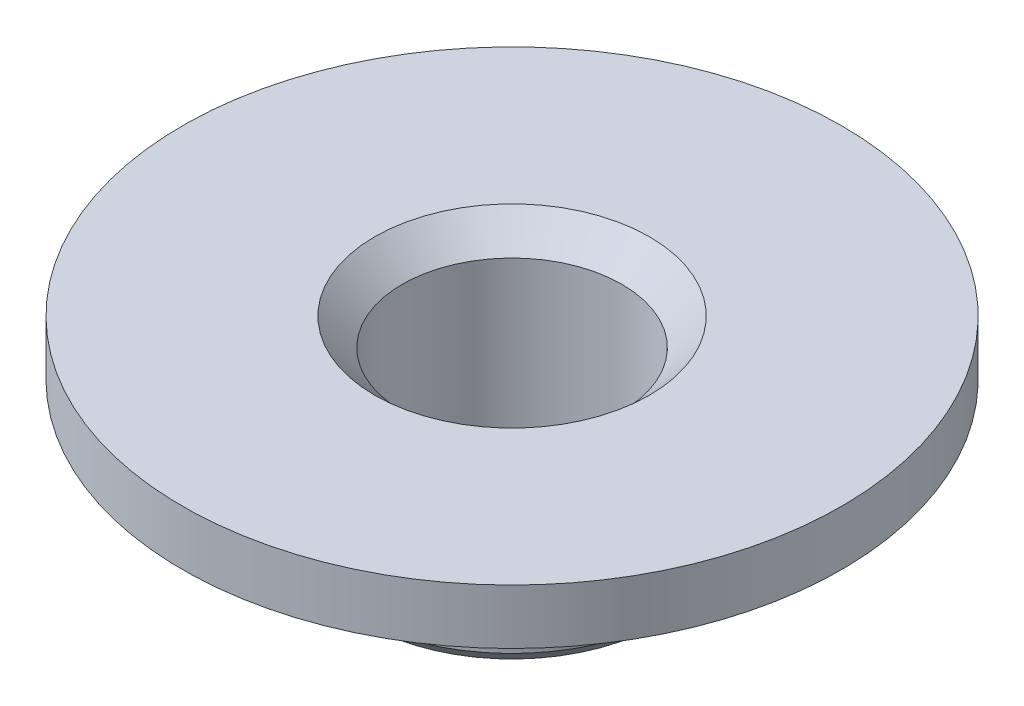
ISO-10303-21;
HEADER;
FILE_DESCRIPTION(('STEP AP214'),'2;1');
FILE_NAME('part.step','',(''),(''),'','','');
FILE_SCHEMA(('AUTOMOTIVE_DESIGN { 1 0 10303 214 1 1 1 1 }'));
ENDSEC;
DATA;
#1=APPLICATION_CONTEXT('core data for automotive mechanical design processes');
#2=APPLICATION_PROTOCOL_DEFINITION('international standard','automotive_design',2000,#1);
#3=PRODUCT_CONTEXT('',#1,'mechanical');
#4=PRODUCT('Part','Part','',(#3));
#5=PRODUCT_RELATED_PRODUCT_CATEGORY('part','',(#4));
#6=PRODUCT_DEFINITION_FORMATION('','',#4);
#7=PRODUCT_DEFINITION_CONTEXT('part definition',#1,'design');
#8=PRODUCT_DEFINITION('design','',#6,#7);
#9=PRODUCT_DEFINITION_SHAPE('','',#8);
#10=(LENGTH_UNIT() NAMED_UNIT(*) SI_UNIT(.MILLI.,.METRE.));
#11=(NAMED_UNIT(*) PLANE_ANGLE_UNIT() SI_UNIT($,.RADIAN.));
#12=(NAMED_UNIT(*) SI_UNIT($,.STERADIAN.) SOLID_ANGLE_UNIT());
#13=UNCERTAINTY_MEASURE_WITH_UNIT(LENGTH_MEASURE(1.E-05),#10,'distance_accuracy_value','');
#14=(GEOMETRIC_REPRESENTATION_CONTEXT(3) GLOBAL_UNCERTAINTY_ASSIGNED_CONTEXT((#13)) GLOBAL_UNIT_ASSIGNED_CONTEXT((#10,
#11,#12)) REPRESENTATION_CONTEXT('',''));
#15=CARTESIAN_POINT('',(0.,0.,0.));
#16=DIRECTION('',(0.,0.,1.));
#17=DIRECTION('',(1.,0.,0.));
#18=AXIS2_PLACEMENT_3D('',#15,#16,#17);
#19=CARTESIAN_POINT('',(3.,0.,0.));
#20=DIRECTION('',(0.,-1.,0.));
#21=DIRECTION('',(0.,0.,-1.));
#22=AXIS2_PLACEMENT_3D('',#19,#20,#21);
#23=PLANE('',#22);
#24=CARTESIAN_POINT('',(0.,0.,0.));
#25=DIRECTION('',(0.,-1.,0.));
#26=DIRECTION('',(0.,0.,-1.));
#27=AXIS2_PLACEMENT_3D('',#24,#25,#26);
#28=CIRCLE('',#27,2.7);
#29=CARTESIAN_POINT('',(0.,0.,2.7));
#30=VERTEX_POINT('',#29);
#31=EDGE_CURVE('E39',#30,#30,#28,.T.);
#32=ORIENTED_EDGE('',*,*,#31,.T.);
#33=EDGE_LOOP('',(#32));
#34=FACE_BOUND('',#33,.T.);
#35=CARTESIAN_POINT('',(0.,0.,0.));
#36=DIRECTION('',(0.,-1.,0.));
#37=DIRECTION('',(0.,0.,-1.));
#38=AXIS2_PLACEMENT_3D('',#35,#36,#37);
#39=CIRCLE('',#38,2.);
#40=CARTESIAN_POINT('',(0.,0.,-2.));
#41=VERTEX_POINT('',#40);
#42=EDGE_CURVE('E58',#41,#41,#39,.T.);
#43=ORIENTED_EDGE('',*,*,#42,.F.);
#44=EDGE_LOOP('',(#43));
#45=FACE_BOUND('',#44,.T.);
#46=ADVANCED_FACE('F32',(#34,#45),#23,.T.);
#47=CARTESIAN_POINT('',(0.,0.,0.));
#48=DIRECTION('',(0.,-1.,0.));
#49=DIRECTION('',(0.,0.,-1.));
#50=AXIS2_PLACEMENT_3D('',#47,#48,#49);
#51=CYLINDRICAL_SURFACE('',#50,2.);
#52=CARTESIAN_POINT('',(0.,3.,0.));
#53=DIRECTION('',(0.,1.,0.));
#54=DIRECTION('',(0.,0.,1.));
#55=AXIS2_PLACEMENT_3D('',#52,#53,#54);
#56=CIRCLE('',#55,2.);
#57=CARTESIAN_POINT('',(0.,3.,2.));
#58=VERTEX_POINT('',#57);
#59=EDGE_CURVE('E52',#58,#58,#56,.T.);
#60=ORIENTED_EDGE('',*,*,#59,.T.);
#61=EDGE_LOOP('',(#60));
#62=FACE_BOUND('',#61,.T.);
#63=ORIENTED_EDGE('',*,*,#42,.T.);
#64=EDGE_LOOP('',(#63));
#65=FACE_BOUND('',#64,.T.);
#66=ADVANCED_FACE('F91',(#62,#65),#51,.F.);
#67=CARTESIAN_POINT('',(2.,3.5,0.));
#68=DIRECTION('',(0.,1.,0.));
#69=DIRECTION('',(0.,0.,1.));
#70=AXIS2_PLACEMENT_3D('',#67,#68,#69);
#71=PLANE('',#70);
#72=CARTESIAN_POINT('',(0.,3.5,0.));
#73=DIRECTION('',(0.,1.,0.));
#74=DIRECTION('',(0.,0.,1.));
#75=AXIS2_PLACEMENT_3D('',#72,#73,#74);
#76=CIRCLE('',#75,2.5);
#77=CARTESIAN_POINT('',(0.,3.5,2.5));
#78=VERTEX_POINT('',#77);
#79=EDGE_CURVE('E55',#78,#78,#76,.F.);
#80=ORIENTED_EDGE('',*,*,#79,.T.);
#81=EDGE_LOOP('',(#80));
#82=FACE_BOUND('',#81,.T.);
#83=CARTESIAN_POINT('',(0.,3.5,0.));
#84=DIRECTION('',(0.,-1.,0.));
#85=DIRECTION('',(0.,0.,-1.));
#86=AXIS2_PLACEMENT_3D('',#83,#84,#85);
#87=CIRCLE('',#86,6.);
#88=CARTESIAN_POINT('',(0.,3.5,-6.));
#89=VERTEX_POINT('',#88);
#90=EDGE_CURVE('E61',#89,#89,#87,.T.);
#91=ORIENTED_EDGE('',*,*,#90,.F.);
#92=EDGE_LOOP('',(#91));
#93=FACE_BOUND('',#92,.T.);
#94=ADVANCED_FACE('F96',(#82,#93),#71,.T.);
#95=CARTESIAN_POINT('',(0.,0.,0.));
#96=DIRECTION('',(0.,-1.,0.));
#97=DIRECTION('',(0.,0.,-1.));
#98=AXIS2_PLACEMENT_3D('',#95,#96,#97);
#99=CYLINDRICAL_SURFACE('',#98,6.);
#100=ORIENTED_EDGE('',*,*,#90,.T.);
#101=EDGE_LOOP('',(#100));
#102=FACE_BOUND('',#101,.T.);
#103=CARTESIAN_POINT('',(0.,2.5,0.));
#104=DIRECTION('',(0.,-1.,0.));
#105=DIRECTION('',(0.,0.,-1.));
#106=AXIS2_PLACEMENT_3D('',#103,#104,#105);
#107=CIRCLE('',#106,6.);
#108=CARTESIAN_POINT('',(0.,2.5,-6.));
#109=VERTEX_POINT('',#108);
#110=EDGE_CURVE('E64',#109,#109,#107,.T.);
#111=ORIENTED_EDGE('',*,*,#110,.F.);
#112=EDGE_LOOP('',(#111));
#113=FACE_BOUND('',#112,.T.);
#114=ADVANCED_FACE('F118',(#102,#113),#99,.T.);
#115=CARTESIAN_POINT('',(6.,2.5,0.));
#116=DIRECTION('',(0.,-1.,0.));
#117=DIRECTION('',(0.,0.,-1.));
#118=AXIS2_PLACEMENT_3D('',#115,#116,#117);
#119=PLANE('',#118);
#120=ORIENTED_EDGE('',*,*,#110,.T.);
#121=EDGE_LOOP('',(#120));
#122=FACE_BOUND('',#121,.T.);
#123=CARTESIAN_POINT('',(0.,2.5,0.));
#124=DIRECTION('',(0.,-1.,0.));
#125=DIRECTION('',(0.,0.,-1.));
#126=AXIS2_PLACEMENT_3D('',#123,#124,#125);
#127=CIRCLE('',#126,4.25);
#128=CARTESIAN_POINT('',(0.,2.5,-4.25));
#129=VERTEX_POINT('',#128);
#130=EDGE_CURVE('E67',#129,#129,#127,.T.);
#131=ORIENTED_EDGE('',*,*,#130,.F.);
#132=EDGE_LOOP('',(#131));
#133=FACE_BOUND('',#132,.T.);
#134=ADVANCED_FACE('F87',(#122,#133),#119,.T.);
#135=CARTESIAN_POINT('',(0.,0.,0.));
#136=DIRECTION('',(0.,-1.,0.));
#137=DIRECTION('',(0.,0.,-1.));
#138=AXIS2_PLACEMENT_3D('',#135,#136,#137);
#139=CYLINDRICAL_SURFACE('',#138,4.25);
#140=CARTESIAN_POINT('',(0.,2.02452458519586,0.));
#141=DIRECTION('',(0.,-1.,0.));
#142=DIRECTION('',(0.,0.,-1.));
#143=AXIS2_PLACEMENT_3D('',#140,#141,#142);
#144=CIRCLE('',#143,4.25);
#145=CARTESIAN_POINT('',(0.,2.02452458519586,-4.25));
#146=VERTEX_POINT('',#145);
#147=EDGE_CURVE('E43',#146,#146,#144,.F.);
#148=ORIENTED_EDGE('',*,*,#147,.T.);
#149=EDGE_LOOP('',(#148));
#150=FACE_BOUND('',#149,.T.);
#151=ORIENTED_EDGE('',*,*,#130,.T.);
#152=EDGE_LOOP('',(#151));
#153=FACE_BOUND('',#152,.T.);
#154=ADVANCED_FACE('F78',(#150,#153),#139,.T.);
#155=CARTESIAN_POINT('',(4.25,1.72452458519585,0.));
#156=DIRECTION('',(0.,-1.,0.));
#157=DIRECTION('',(0.,0.,-1.));
#158=AXIS2_PLACEMENT_3D('',#155,#156,#157);
#159=PLANE('',#158);
#160=CARTESIAN_POINT('',(0.,1.72452458519585,0.));
#161=DIRECTION('',(0.,-1.,0.));
#162=DIRECTION('',(0.,0.,-1.));
#163=AXIS2_PLACEMENT_3D('',#160,#161,#162);
#164=CIRCLE('',#163,3.95);
#165=CARTESIAN_POINT('',(0.,1.72452458519585,-3.95));
#166=VERTEX_POINT('',#165);
#167=EDGE_CURVE('E47',#166,#166,#164,.T.);
#168=ORIENTED_EDGE('',*,*,#167,.T.);
#169=EDGE_LOOP('',(#168));
#170=FACE_BOUND('',#169,.T.);
#171=CARTESIAN_POINT('',(0.,1.72452458519585,0.));
#172=DIRECTION('',(0.,-1.,0.));
#173=DIRECTION('',(0.,0.,-1.));
#174=AXIS2_PLACEMENT_3D('',#171,#172,#173);
#175=CIRCLE('',#174,3.);
#176=CARTESIAN_POINT('',(0.,1.72452458519585,-3.));
#177=VERTEX_POINT('',#176);
#178=EDGE_CURVE('E70',#177,#177,#175,.T.);
#179=ORIENTED_EDGE('',*,*,#178,.F.);
#180=EDGE_LOOP('',(#179));
#181=FACE_BOUND('',#180,.T.);
#182=ADVANCED_FACE('F76',(#170,#181),#159,.T.);
#183=CARTESIAN_POINT('',(0.,0.,0.));
#184=DIRECTION('',(0.,-1.,0.));
#185=DIRECTION('',(0.,0.,-1.));
#186=AXIS2_PLACEMENT_3D('',#183,#184,#185);
#187=CYLINDRICAL_SURFACE('',#186,3.);
#188=CARTESIAN_POINT('',(0.,0.299999999999999,0.));
#189=DIRECTION('',(0.,-1.,0.));
#190=DIRECTION('',(0.,0.,-1.));
#191=AXIS2_PLACEMENT_3D('',#188,#189,#190);
#192=CIRCLE('',#191,3.);
#193=CARTESIAN_POINT('',(0.,0.299999999999999,3.));
#194=VERTEX_POINT('',#193);
#195=EDGE_CURVE('E10',#194,#194,#192,.F.);
#196=ORIENTED_EDGE('',*,*,#195,.T.);
#197=EDGE_LOOP('',(#196));
#198=FACE_BOUND('',#197,.T.);
#199=ORIENTED_EDGE('',*,*,#178,.T.);
#200=EDGE_LOOP('',(#199));
#201=FACE_BOUND('',#200,.T.);
#202=ADVANCED_FACE('F74',(#198,#201),#187,.T.);
#203=CARTESIAN_POINT('',(0.,3.5,0.));
#204=DIRECTION('',(0.,1.,0.));
#205=DIRECTION('',(0.,0.,1.));
#206=AXIS2_PLACEMENT_3D('',#203,#204,#205);
#207=CONICAL_SURFACE('',#206,2.5,0.785398163397445);
#208=ORIENTED_EDGE('',*,*,#59,.F.);
#209=EDGE_LOOP('',(#208));
#210=FACE_BOUND('',#209,.T.);
#211=ORIENTED_EDGE('',*,*,#79,.F.);
#212=EDGE_LOOP('',(#211));
#213=FACE_BOUND('',#212,.T.);
#214=ADVANCED_FACE('F85',(#210,#213),#207,.F.);
#215=CARTESIAN_POINT('',(0.,1.72452458519585,0.));
#216=DIRECTION('',(0.,1.,0.));
#217=DIRECTION('',(0.,0.,1.));
#218=AXIS2_PLACEMENT_3D('',#215,#216,#217);
#219=CONICAL_SURFACE('',#218,3.95,0.785398163397447);
#220=ORIENTED_EDGE('',*,*,#147,.F.);
#221=EDGE_LOOP('',(#220));
#222=FACE_BOUND('',#221,.T.);
#223=ORIENTED_EDGE('',*,*,#167,.F.);
#224=EDGE_LOOP('',(#223));
#225=FACE_BOUND('',#224,.T.);
#226=ADVANCED_FACE('F103',(#222,#225),#219,.T.);
#227=CARTESIAN_POINT('',(0.,0.,0.));
#228=DIRECTION('',(0.,1.,0.));
#229=DIRECTION('',(0.,0.,1.));
#230=AXIS2_PLACEMENT_3D('',#227,#228,#229);
#231=CONICAL_SURFACE('',#230,2.7,0.785398163397448);
#232=CARTESIAN_POINT('',(0.,0.299999999999999,3.));
#233=CARTESIAN_POINT('',(0.,0.296874999999999,2.996875));
#234=CARTESIAN_POINT('',(0.,0.293749999999999,2.99375));
#235=CARTESIAN_POINT('',(0.,0.287499999999999,2.9875));
#236=CARTESIAN_POINT('',(0.,0.284374999999999,2.984375));
#237=CARTESIAN_POINT('',(0.,0.278124999999999,2.978125));
#238=CARTESIAN_POINT('',(0.,0.274999999999999,2.975));
#239=CARTESIAN_POINT('',(0.,0.268749999999999,2.96875));
#240=CARTESIAN_POINT('',(0.,0.265624999999999,2.965625));
#241=CARTESIAN_POINT('',(0.,0.259374999999999,2.959375));
#242=CARTESIAN_POINT('',(0.,0.256249999999999,2.95625));
#243=CARTESIAN_POINT('',(0.,0.249999999999999,2.95));
#244=CARTESIAN_POINT('',(0.,0.246874999999999,2.946875));
#245=CARTESIAN_POINT('',(0.,0.240624999999999,2.940625));
#246=CARTESIAN_POINT('',(0.,0.237499999999999,2.9375));
#247=CARTESIAN_POINT('',(0.,0.231249999999999,2.93125));
#248=CARTESIAN_POINT('',(0.,0.228124999999999,2.928125));
#249=CARTESIAN_POINT('',(0.,0.221874999999999,2.921875));
#250=CARTESIAN_POINT('',(0.,0.218749999999999,2.91875));
#251=CARTESIAN_POINT('',(0.,0.212499999999999,2.9125));
#252=CARTESIAN_POINT('',(0.,0.209374999999999,2.909375));
#253=CARTESIAN_POINT('',(0.,0.203124999999999,2.903125));
#254=CARTESIAN_POINT('',(0.,0.199999999999999,2.9));
#255=CARTESIAN_POINT('',(0.,0.193749999999999,2.89375));
#256=CARTESIAN_POINT('',(0.,0.190624999999999,2.890625));
#257=CARTESIAN_POINT('',(0.,0.184374999999999,2.884375));
#258=CARTESIAN_POINT('',(0.,0.181249999999999,2.88125));
#259=CARTESIAN_POINT('',(0.,0.174999999999999,2.875));
#260=CARTESIAN_POINT('',(0.,0.171874999999999,2.871875));
#261=CARTESIAN_POINT('',(0.,0.165624999999999,2.865625));
#262=CARTESIAN_POINT('',(0.,0.162499999999999,2.8625));
#263=CARTESIAN_POINT('',(0.,0.156249999999999,2.85625));
#264=CARTESIAN_POINT('',(0.,0.153124999999999,2.853125));
#265=CARTESIAN_POINT('',(0.,0.146874999999999,2.846875));
#266=CARTESIAN_POINT('',(0.,0.143749999999999,2.84375));
#267=CARTESIAN_POINT('',(0.,0.137499999999999,2.8375));
#268=CARTESIAN_POINT('',(0.,0.134374999999999,2.834375));
#269=CARTESIAN_POINT('',(0.,0.128124999999999,2.828125));
#270=CARTESIAN_POINT('',(0.,0.124999999999999,2.825));
#271=CARTESIAN_POINT('',(0.,0.11875,2.81875));
#272=CARTESIAN_POINT('',(0.,0.115625,2.815625));
#273=CARTESIAN_POINT('',(0.,0.109375,2.809375));
#274=CARTESIAN_POINT('',(0.,0.10625,2.80625));
#275=CARTESIAN_POINT('',(0.,0.0999999999999996,2.8));
#276=CARTESIAN_POINT('',(0.,0.0968749999999996,2.796875));
#277=CARTESIAN_POINT('',(0.,0.0906249999999997,2.790625));
#278=CARTESIAN_POINT('',(0.,0.0874999999999996,2.7875));
#279=CARTESIAN_POINT('',(0.,0.0812499999999997,2.78125));
#280=CARTESIAN_POINT('',(0.,0.0781249999999998,2.778125));
#281=CARTESIAN_POINT('',(0.,0.0718749999999998,2.771875));
#282=CARTESIAN_POINT('',(0.,0.0687499999999998,2.76875));
#283=CARTESIAN_POINT('',(0.,0.0624999999999998,2.7625));
#284=CARTESIAN_POINT('',(0.,0.0593749999999997,2.759375));
#285=CARTESIAN_POINT('',(0.,0.0531249999999998,2.753125));
#286=CARTESIAN_POINT('',(0.,0.0499999999999999,2.75));
#287=CARTESIAN_POINT('',(0.,0.0437499999999999,2.74375));
#288=CARTESIAN_POINT('',(0.,0.0406249999999999,2.740625));
#289=CARTESIAN_POINT('',(0.,0.0343749999999999,2.734375));
#290=CARTESIAN_POINT('',(0.,0.0312499999999999,2.73125));
#291=CARTESIAN_POINT('',(0.,0.025,2.725));
#292=CARTESIAN_POINT('',(0.,0.021875,2.721875));
#293=CARTESIAN_POINT('',(0.,0.015625,2.715625));
#294=CARTESIAN_POINT('',(0.,0.0125,2.7125));
#295=CARTESIAN_POINT('',(0.,0.00625000000000009,2.70625));
#296=CARTESIAN_POINT('',(0.,0.00312500000000014,2.703125));
#297=CARTESIAN_POINT('',(0.,0.,2.7));
#298=B_SPLINE_CURVE_WITH_KNOTS('',3,(#232,#233,#234,#235,#236,#237,#238,#239,#240,#241,#242,
#243,#244,#245,#246,#247,#248,#249,#250,#251,#252,#253,#254,#255,#256,#257,#258,#259,#260,#261,
#262,#263,#264,#265,#266,#267,#268,#269,#270,#271,#272,#273,#274,#275,#276,#277,#278,#279,#280,
#281,#282,#283,#284,#285,#286,#287,#288,#289,#290,#291,#292,#293,#294,#295,#296,#297),
.UNSPECIFIED.,.F.,.F.,(4,2,2,2,2,2,2,2,2,2,2,2,2,2,2,2,2,2,2,2,2,2,2,2,2,2,2,2,2,2,2,2,4),(0.,
0.0132582521472476,0.0265165042944953,0.0397747564417432,0.0530330085889908,0.0662912607362384,
0.0795495128834863,0.0928077650307339,0.106066017177982,0.119324269325229,0.132582521472477,
0.145840773619725,0.159099025766972,0.17235727791422,0.185615530061468,0.198873782208716,
0.212132034355963,0.225390286503211,0.238648538650459,0.251906790797706,0.265165042944954,
0.278423295092202,0.291681547239449,0.304939799386697,0.318198051533945,0.331456303681193,
0.34471455582844,0.357972807975688,0.371231060122936,0.384489312270183,0.397747564417431,
0.411005816564679,0.424264068711927),.UNSPECIFIED.);
#299=EDGE_CURVE('BSEAM34',#194,#30,#298,.T.);
#300=ORIENTED_EDGE('',*,*,#195,.F.);
#301=ORIENTED_EDGE('',*,*,#31,.F.);
#302=ORIENTED_EDGE('',*,*,#299,.T.);
#303=ORIENTED_EDGE('',*,*,#299,.F.);
#304=EDGE_LOOP('',(#300,#302,#301,#303));
#305=FACE_BOUND('',#304,.T.);
#306=ADVANCED_FACE('F34',(#305),#231,.T.);
#307=CLOSED_SHELL('',(#46,#66,#94,#114,#134,#154,#182,#202,#214,#226,#306));
#308=MANIFOLD_SOLID_BREP('B2',#307);
#309=ADVANCED_BREP_SHAPE_REPRESENTATION('',(#18,#308),#14);
#310=SHAPE_DEFINITION_REPRESENTATION(#9,#309);
ENDSEC;
END-ISO-10303-21;
